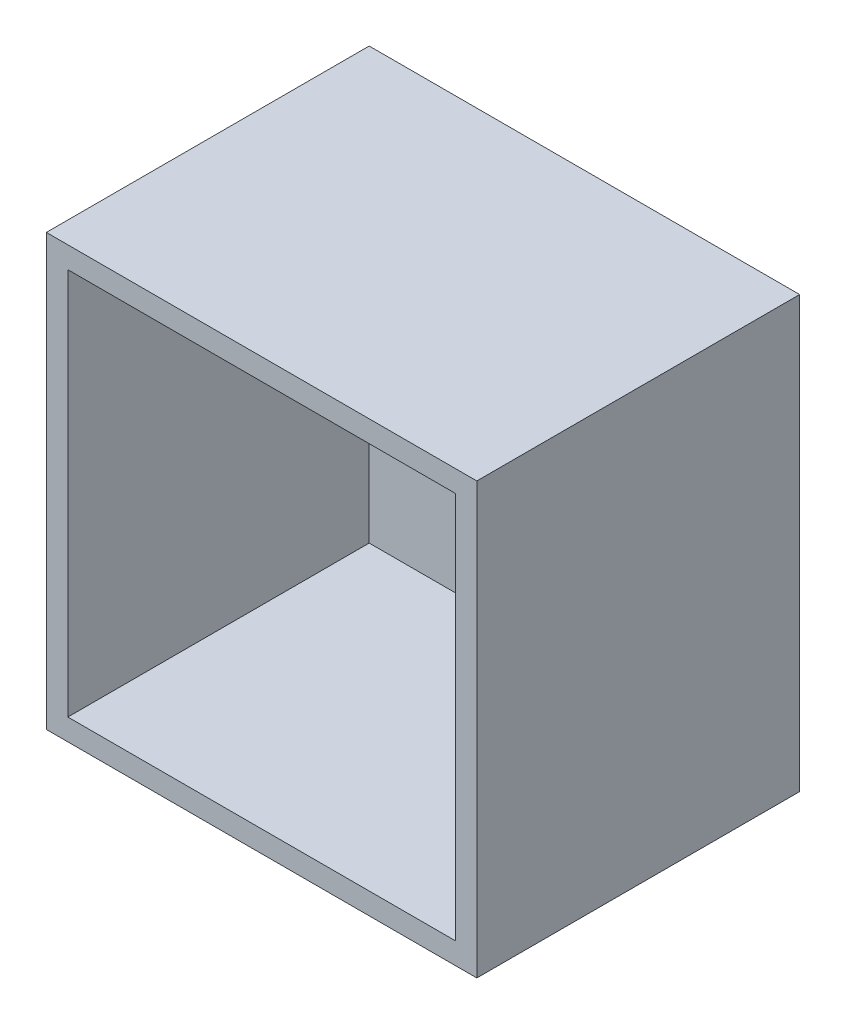
ISO-10303-21;
HEADER;
FILE_DESCRIPTION(('STEP AP214'),'2;1');
FILE_NAME('part.step','',(''),(''),'','','');
FILE_SCHEMA(('AUTOMOTIVE_DESIGN { 1 0 10303 214 1 1 1 1 }'));
ENDSEC;
DATA;
#1=APPLICATION_CONTEXT('core data for automotive mechanical design processes');
#2=APPLICATION_PROTOCOL_DEFINITION('international standard','automotive_design',2000,#1);
#3=PRODUCT_CONTEXT('',#1,'mechanical');
#4=PRODUCT('Part','Part','',(#3));
#5=PRODUCT_RELATED_PRODUCT_CATEGORY('part','',(#4));
#6=PRODUCT_DEFINITION_FORMATION('','',#4);
#7=PRODUCT_DEFINITION_CONTEXT('part definition',#1,'design');
#8=PRODUCT_DEFINITION('design','',#6,#7);
#9=PRODUCT_DEFINITION_SHAPE('','',#8);
#10=(LENGTH_UNIT() NAMED_UNIT(*) SI_UNIT(.MILLI.,.METRE.));
#11=(NAMED_UNIT(*) PLANE_ANGLE_UNIT() SI_UNIT($,.RADIAN.));
#12=(NAMED_UNIT(*) SI_UNIT($,.STERADIAN.) SOLID_ANGLE_UNIT());
#13=UNCERTAINTY_MEASURE_WITH_UNIT(LENGTH_MEASURE(1.E-05),#10,'distance_accuracy_value','');
#14=(GEOMETRIC_REPRESENTATION_CONTEXT(3) GLOBAL_UNCERTAINTY_ASSIGNED_CONTEXT((#13)) GLOBAL_UNIT_ASSIGNED_CONTEXT((#10,
#11,#12)) REPRESENTATION_CONTEXT('',''));
#15=CARTESIAN_POINT('',(0.,0.,0.));
#16=DIRECTION('',(0.,0.,1.));
#17=DIRECTION('',(1.,0.,0.));
#18=AXIS2_PLACEMENT_3D('',#15,#16,#17);
#19=CARTESIAN_POINT('',(0.,0.,100.));
#20=DIRECTION('',(0.,0.,1.));
#21=DIRECTION('',(1.,0.,0.));
#22=AXIS2_PLACEMENT_3D('',#19,#20,#21);
#23=PLANE('',#22);
#24=DIRECTION('',(-1.,0.,0.));
#25=VECTOR('',#24,1.);
#26=CARTESIAN_POINT('',(1.11022302462516E-13,-900.,100.));
#27=LINE('',#26,#25);
#28=CARTESIAN_POINT('',(900.,-900.,100.));
#29=VERTEX_POINT('',#28);
#30=CARTESIAN_POINT('',(-900.,-900.,100.));
#31=VERTEX_POINT('',#30);
#32=EDGE_CURVE('E184',#29,#31,#27,.T.);
#33=ORIENTED_EDGE('',*,*,#32,.F.);
#34=DIRECTION('',(0.,1.,0.));
#35=VECTOR('',#34,1.);
#36=CARTESIAN_POINT('',(900.,0.,100.));
#37=LINE('',#36,#35);
#38=CARTESIAN_POINT('',(900.,900.,100.));
#39=VERTEX_POINT('',#38);
#40=EDGE_CURVE('E68',#29,#39,#37,.T.);
#41=ORIENTED_EDGE('',*,*,#40,.T.);
#42=DIRECTION('',(-1.,0.,0.));
#43=VECTOR('',#42,1.);
#44=CARTESIAN_POINT('',(0.,900.,100.));
#45=LINE('',#44,#43);
#46=CARTESIAN_POINT('',(-900.,900.,100.));
#47=VERTEX_POINT('',#46);
#48=EDGE_CURVE('E54',#39,#47,#45,.T.);
#49=ORIENTED_EDGE('',*,*,#48,.T.);
#50=DIRECTION('',(0.,1.,0.));
#51=VECTOR('',#50,1.);
#52=CARTESIAN_POINT('',(-900.,0.,100.));
#53=LINE('',#52,#51);
#54=EDGE_CURVE('E11',#31,#47,#53,.T.);
#55=ORIENTED_EDGE('',*,*,#54,.F.);
#56=EDGE_LOOP('',(#33,#41,#49,#55));
#57=FACE_BOUND('',#56,.T.);
#58=ADVANCED_FACE('F45',(#57),#23,.T.);
#59=CARTESIAN_POINT('',(900.,0.,1500.));
#60=DIRECTION('',(-1.,0.,0.));
#61=DIRECTION('',(0.,-1.,0.));
#62=AXIS2_PLACEMENT_3D('',#59,#60,#61);
#63=PLANE('',#62);
#64=DIRECTION('',(0.,0.,-1.));
#65=VECTOR('',#64,1.);
#66=CARTESIAN_POINT('',(900.,900.,1500.));
#67=LINE('',#66,#65);
#68=CARTESIAN_POINT('',(900.,900.,1500.));
#69=VERTEX_POINT('',#68);
#70=EDGE_CURVE('E123',#69,#39,#67,.T.);
#71=ORIENTED_EDGE('',*,*,#70,.T.);
#72=ORIENTED_EDGE('',*,*,#40,.F.);
#73=DIRECTION('',(0.,0.,-1.));
#74=VECTOR('',#73,1.);
#75=CARTESIAN_POINT('',(900.,-900.,1500.));
#76=LINE('',#75,#74);
#77=CARTESIAN_POINT('',(900.,-900.,1500.));
#78=VERTEX_POINT('',#77);
#79=EDGE_CURVE('E181',#78,#29,#76,.T.);
#80=ORIENTED_EDGE('',*,*,#79,.F.);
#81=DIRECTION('',(0.,1.,0.));
#82=VECTOR('',#81,1.);
#83=CARTESIAN_POINT('',(900.,0.,1500.));
#84=LINE('',#83,#82);
#85=EDGE_CURVE('E147',#78,#69,#84,.T.);
#86=ORIENTED_EDGE('',*,*,#85,.T.);
#87=EDGE_LOOP('',(#71,#72,#80,#86));
#88=FACE_BOUND('',#87,.T.);
#89=ADVANCED_FACE('F202',(#88),#63,.T.);
#90=CARTESIAN_POINT('',(1.11022302462516E-13,-900.,1500.));
#91=DIRECTION('',(0.,-1.,0.));
#92=DIRECTION('',(1.,0.,0.));
#93=AXIS2_PLACEMENT_3D('',#90,#91,#92);
#94=PLANE('',#93);
#95=ORIENTED_EDGE('',*,*,#32,.T.);
#96=DIRECTION('',(0.,0.,-1.));
#97=VECTOR('',#96,1.);
#98=CARTESIAN_POINT('',(-900.,-900.,1500.));
#99=LINE('',#98,#97);
#100=CARTESIAN_POINT('',(-900.,-900.,1500.));
#101=VERTEX_POINT('',#100);
#102=EDGE_CURVE('E177',#101,#31,#99,.T.);
#103=ORIENTED_EDGE('',*,*,#102,.F.);
#104=DIRECTION('',(-1.,0.,0.));
#105=VECTOR('',#104,1.);
#106=CARTESIAN_POINT('',(1.11022302462516E-13,-900.,1500.));
#107=LINE('',#106,#105);
#108=EDGE_CURVE('E151',#78,#101,#107,.T.);
#109=ORIENTED_EDGE('',*,*,#108,.F.);
#110=ORIENTED_EDGE('',*,*,#79,.T.);
#111=EDGE_LOOP('',(#95,#103,#109,#110));
#112=FACE_BOUND('',#111,.T.);
#113=ADVANCED_FACE('F210',(#112),#94,.F.);
#114=CARTESIAN_POINT('',(-900.,0.,1500.));
#115=DIRECTION('',(-1.,0.,0.));
#116=DIRECTION('',(0.,-1.,0.));
#117=AXIS2_PLACEMENT_3D('',#114,#115,#116);
#118=PLANE('',#117);
#119=ORIENTED_EDGE('',*,*,#54,.T.);
#120=DIRECTION('',(0.,0.,-1.));
#121=VECTOR('',#120,1.);
#122=CARTESIAN_POINT('',(-900.,900.,1500.));
#123=LINE('',#122,#121);
#124=CARTESIAN_POINT('',(-900.,900.,1500.));
#125=VERTEX_POINT('',#124);
#126=EDGE_CURVE('E61',#125,#47,#123,.T.);
#127=ORIENTED_EDGE('',*,*,#126,.F.);
#128=DIRECTION('',(0.,1.,0.));
#129=VECTOR('',#128,1.);
#130=CARTESIAN_POINT('',(-900.,0.,1500.));
#131=LINE('',#130,#129);
#132=EDGE_CURVE('E155',#101,#125,#131,.T.);
#133=ORIENTED_EDGE('',*,*,#132,.F.);
#134=ORIENTED_EDGE('',*,*,#102,.T.);
#135=EDGE_LOOP('',(#119,#127,#133,#134));
#136=FACE_BOUND('',#135,.T.);
#137=ADVANCED_FACE('F208',(#136),#118,.F.);
#138=CARTESIAN_POINT('',(-1000.,0.,1500.));
#139=DIRECTION('',(-1.,0.,0.));
#140=DIRECTION('',(0.,0.,1.));
#141=AXIS2_PLACEMENT_3D('',#138,#139,#140);
#142=PLANE('',#141);
#143=DIRECTION('',(0.,1.,0.));
#144=VECTOR('',#143,1.);
#145=CARTESIAN_POINT('',(-1000.,0.,0.));
#146=LINE('',#145,#144);
#147=CARTESIAN_POINT('',(-1000.,-1000.,0.));
#148=VERTEX_POINT('',#147);
#149=CARTESIAN_POINT('',(-1000.,1000.,0.));
#150=VERTEX_POINT('',#149);
#151=EDGE_CURVE('E117',#148,#150,#146,.T.);
#152=ORIENTED_EDGE('',*,*,#151,.F.);
#153=DIRECTION('',(0.,0.,-1.));
#154=VECTOR('',#153,1.);
#155=CARTESIAN_POINT('',(-1000.,-1000.,1500.));
#156=LINE('',#155,#154);
#157=CARTESIAN_POINT('',(-1000.,-1000.,1500.));
#158=VERTEX_POINT('',#157);
#159=EDGE_CURVE('E112',#158,#148,#156,.T.);
#160=ORIENTED_EDGE('',*,*,#159,.F.);
#161=DIRECTION('',(0.,1.,0.));
#162=VECTOR('',#161,1.);
#163=CARTESIAN_POINT('',(-1000.,0.,1500.));
#164=LINE('',#163,#162);
#165=CARTESIAN_POINT('',(-1000.,1000.,1500.));
#166=VERTEX_POINT('',#165);
#167=EDGE_CURVE('E115',#158,#166,#164,.T.);
#168=ORIENTED_EDGE('',*,*,#167,.T.);
#169=DIRECTION('',(0.,0.,-1.));
#170=VECTOR('',#169,1.);
#171=CARTESIAN_POINT('',(-1000.,1000.,1500.));
#172=LINE('',#171,#170);
#173=EDGE_CURVE('E161',#166,#150,#172,.T.);
#174=ORIENTED_EDGE('',*,*,#173,.T.);
#175=EDGE_LOOP('',(#152,#160,#168,#174));
#176=FACE_BOUND('',#175,.T.);
#177=ADVANCED_FACE('F114',(#176),#142,.T.);
#178=CARTESIAN_POINT('',(2.22044604925031E-13,-1000.,1500.));
#179=DIRECTION('',(0.,-1.,0.));
#180=DIRECTION('',(1.,0.,0.));
#181=AXIS2_PLACEMENT_3D('',#178,#179,#180);
#182=PLANE('',#181);
#183=DIRECTION('',(-1.,0.,0.));
#184=VECTOR('',#183,1.);
#185=CARTESIAN_POINT('',(2.22044604925031E-13,-1000.,0.));
#186=LINE('',#185,#184);
#187=CARTESIAN_POINT('',(1000.,-1000.,0.));
#188=VERTEX_POINT('',#187);
#189=EDGE_CURVE('E164',#188,#148,#186,.T.);
#190=ORIENTED_EDGE('',*,*,#189,.F.);
#191=DIRECTION('',(0.,0.,-1.));
#192=VECTOR('',#191,1.);
#193=CARTESIAN_POINT('',(1000.,-1000.,1500.));
#194=LINE('',#193,#192);
#195=CARTESIAN_POINT('',(1000.,-1000.,1500.));
#196=VERTEX_POINT('',#195);
#197=EDGE_CURVE('E124',#196,#188,#194,.T.);
#198=ORIENTED_EDGE('',*,*,#197,.F.);
#199=DIRECTION('',(-1.,0.,0.));
#200=VECTOR('',#199,1.);
#201=CARTESIAN_POINT('',(2.22044604925031E-13,-1000.,1500.));
#202=LINE('',#201,#200);
#203=EDGE_CURVE('E130',#196,#158,#202,.T.);
#204=ORIENTED_EDGE('',*,*,#203,.T.);
#205=ORIENTED_EDGE('',*,*,#159,.T.);
#206=EDGE_LOOP('',(#190,#198,#204,#205));
#207=FACE_BOUND('',#206,.T.);
#208=ADVANCED_FACE('F137',(#207),#182,.T.);
#209=CARTESIAN_POINT('',(1000.,0.,1500.));
#210=DIRECTION('',(-1.,0.,0.));
#211=DIRECTION('',(0.,-1.,0.));
#212=AXIS2_PLACEMENT_3D('',#209,#210,#211);
#213=PLANE('',#212);
#214=DIRECTION('',(0.,1.,0.));
#215=VECTOR('',#214,1.);
#216=CARTESIAN_POINT('',(1000.,0.,0.));
#217=LINE('',#216,#215);
#218=CARTESIAN_POINT('',(1000.,1000.,0.));
#219=VERTEX_POINT('',#218);
#220=EDGE_CURVE('E167',#188,#219,#217,.T.);
#221=ORIENTED_EDGE('',*,*,#220,.T.);
#222=DIRECTION('',(0.,0.,-1.));
#223=VECTOR('',#222,1.);
#224=CARTESIAN_POINT('',(1000.,1000.,1500.));
#225=LINE('',#224,#223);
#226=CARTESIAN_POINT('',(1000.,1000.,1500.));
#227=VERTEX_POINT('',#226);
#228=EDGE_CURVE('E187',#227,#219,#225,.T.);
#229=ORIENTED_EDGE('',*,*,#228,.F.);
#230=DIRECTION('',(0.,1.,0.));
#231=VECTOR('',#230,1.);
#232=CARTESIAN_POINT('',(1000.,0.,1500.));
#233=LINE('',#232,#231);
#234=EDGE_CURVE('E140',#196,#227,#233,.T.);
#235=ORIENTED_EDGE('',*,*,#234,.F.);
#236=ORIENTED_EDGE('',*,*,#197,.T.);
#237=EDGE_LOOP('',(#221,#229,#235,#236));
#238=FACE_BOUND('',#237,.T.);
#239=ADVANCED_FACE('F227',(#238),#213,.F.);
#240=CARTESIAN_POINT('',(-1.66533453693773E-13,1000.,1500.));
#241=DIRECTION('',(0.,-1.,0.));
#242=DIRECTION('',(1.,0.,0.));
#243=AXIS2_PLACEMENT_3D('',#240,#241,#242);
#244=PLANE('',#243);
#245=DIRECTION('',(-1.,0.,0.));
#246=VECTOR('',#245,1.);
#247=CARTESIAN_POINT('',(-1.66533453693773E-13,1000.,0.));
#248=LINE('',#247,#246);
#249=EDGE_CURVE('E135',#219,#150,#248,.T.);
#250=ORIENTED_EDGE('',*,*,#249,.T.);
#251=ORIENTED_EDGE('',*,*,#173,.F.);
#252=DIRECTION('',(-1.,0.,0.));
#253=VECTOR('',#252,1.);
#254=CARTESIAN_POINT('',(-1.66533453693773E-13,1000.,1500.));
#255=LINE('',#254,#253);
#256=EDGE_CURVE('E132',#227,#166,#255,.T.);
#257=ORIENTED_EDGE('',*,*,#256,.F.);
#258=ORIENTED_EDGE('',*,*,#228,.T.);
#259=EDGE_LOOP('',(#250,#251,#257,#258));
#260=FACE_BOUND('',#259,.T.);
#261=ADVANCED_FACE('F230',(#260),#244,.F.);
#262=CARTESIAN_POINT('',(0.,900.,1500.));
#263=DIRECTION('',(0.,-1.,0.));
#264=DIRECTION('',(1.,0.,0.));
#265=AXIS2_PLACEMENT_3D('',#262,#263,#264);
#266=PLANE('',#265);
#267=ORIENTED_EDGE('',*,*,#126,.T.);
#268=ORIENTED_EDGE('',*,*,#48,.F.);
#269=ORIENTED_EDGE('',*,*,#70,.F.);
#270=DIRECTION('',(-1.,0.,0.));
#271=VECTOR('',#270,1.);
#272=CARTESIAN_POINT('',(0.,900.,1500.));
#273=LINE('',#272,#271);
#274=EDGE_CURVE('E158',#69,#125,#273,.T.);
#275=ORIENTED_EDGE('',*,*,#274,.T.);
#276=EDGE_LOOP('',(#267,#268,#269,#275));
#277=FACE_BOUND('',#276,.T.);
#278=ADVANCED_FACE('F201',(#277),#266,.T.);
#279=CARTESIAN_POINT('',(0.,0.,1500.));
#280=DIRECTION('',(0.,0.,1.));
#281=DIRECTION('',(1.,0.,0.));
#282=AXIS2_PLACEMENT_3D('',#279,#280,#281);
#283=PLANE('',#282);
#284=ORIENTED_EDGE('',*,*,#167,.F.);
#285=ORIENTED_EDGE('',*,*,#203,.F.);
#286=ORIENTED_EDGE('',*,*,#234,.T.);
#287=ORIENTED_EDGE('',*,*,#256,.T.);
#288=EDGE_LOOP('',(#284,#285,#286,#287));
#289=FACE_BOUND('',#288,.T.);
#290=ORIENTED_EDGE('',*,*,#85,.F.);
#291=ORIENTED_EDGE('',*,*,#108,.T.);
#292=ORIENTED_EDGE('',*,*,#132,.T.);
#293=ORIENTED_EDGE('',*,*,#274,.F.);
#294=EDGE_LOOP('',(#290,#291,#292,#293));
#295=FACE_BOUND('',#294,.T.);
#296=ADVANCED_FACE('F128',(#289,#295),#283,.T.);
#297=CARTESIAN_POINT('',(0.,0.,0.));
#298=DIRECTION('',(0.,0.,1.));
#299=DIRECTION('',(1.,0.,0.));
#300=AXIS2_PLACEMENT_3D('',#297,#298,#299);
#301=PLANE('',#300);
#302=ORIENTED_EDGE('',*,*,#151,.T.);
#303=ORIENTED_EDGE('',*,*,#249,.F.);
#304=ORIENTED_EDGE('',*,*,#220,.F.);
#305=ORIENTED_EDGE('',*,*,#189,.T.);
#306=EDGE_LOOP('',(#302,#303,#304,#305));
#307=FACE_BOUND('',#306,.T.);
#308=ADVANCED_FACE('F47',(#307),#301,.F.);
#309=CLOSED_SHELL('',(#58,#89,#113,#137,#177,#208,#239,#261,#278,#296,#308));
#310=MANIFOLD_SOLID_BREP('B2',#309);
#311=ADVANCED_BREP_SHAPE_REPRESENTATION('',(#18,#310),#14);
#312=SHAPE_DEFINITION_REPRESENTATION(#9,#311);
ENDSEC;
END-ISO-10303-21;
